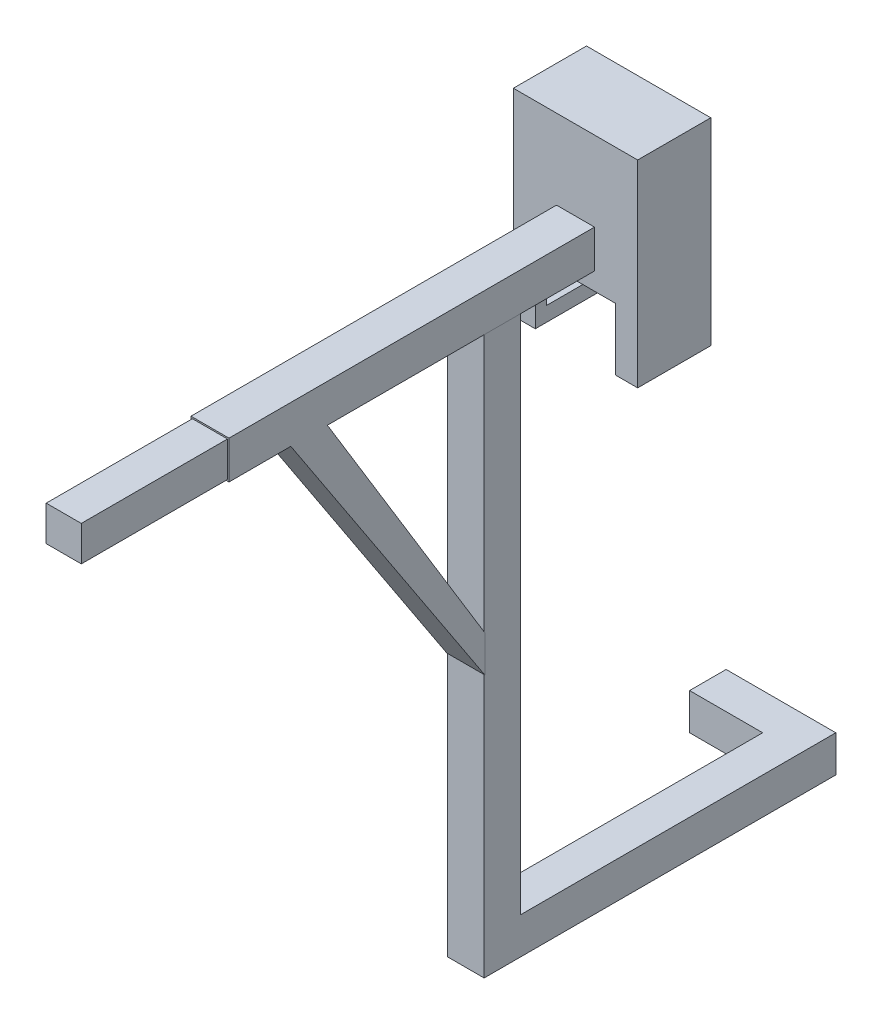
ISO-10303-21;
HEADER;
FILE_DESCRIPTION(('STEP AP214'),'2;1');
FILE_NAME('part.step','',(''),(''),'','','');
FILE_SCHEMA(('AUTOMOTIVE_DESIGN { 1 0 10303 214 1 1 1 1 }'));
ENDSEC;
DATA;
#1=APPLICATION_CONTEXT('core data for automotive mechanical design processes');
#2=APPLICATION_PROTOCOL_DEFINITION('international standard','automotive_design',2000,#1);
#3=PRODUCT_CONTEXT('',#1,'mechanical');
#4=PRODUCT('Part','Part','',(#3));
#5=PRODUCT_RELATED_PRODUCT_CATEGORY('part','',(#4));
#6=PRODUCT_DEFINITION_FORMATION('','',#4);
#7=PRODUCT_DEFINITION_CONTEXT('part definition',#1,'design');
#8=PRODUCT_DEFINITION('design','',#6,#7);
#9=PRODUCT_DEFINITION_SHAPE('','',#8);
#10=(LENGTH_UNIT() NAMED_UNIT(*) SI_UNIT(.MILLI.,.METRE.));
#11=(NAMED_UNIT(*) PLANE_ANGLE_UNIT() SI_UNIT($,.RADIAN.));
#12=(NAMED_UNIT(*) SI_UNIT($,.STERADIAN.) SOLID_ANGLE_UNIT());
#13=UNCERTAINTY_MEASURE_WITH_UNIT(LENGTH_MEASURE(1.E-05),#10,'distance_accuracy_value','');
#14=(GEOMETRIC_REPRESENTATION_CONTEXT(3) GLOBAL_UNCERTAINTY_ASSIGNED_CONTEXT((#13)) GLOBAL_UNIT_ASSIGNED_CONTEXT((#10,
#11,#12)) REPRESENTATION_CONTEXT('',''));
#15=CARTESIAN_POINT('',(0.,0.,0.));
#16=DIRECTION('',(0.,0.,1.));
#17=DIRECTION('',(1.,0.,0.));
#18=AXIS2_PLACEMENT_3D('',#15,#16,#17);
#19=CARTESIAN_POINT('',(-0.100000000000036,-81.3,-40.));
#20=DIRECTION('',(-1.,0.,0.));
#21=DIRECTION('',(0.,-1.,0.));
#22=AXIS2_PLACEMENT_3D('',#19,#20,#21);
#23=PLANE('',#22);
#24=DIRECTION('',(0.,0.,1.));
#25=VECTOR('',#24,1.);
#26=CARTESIAN_POINT('',(-0.100000000000036,-76.3,-83.1));
#27=LINE('',#26,#25);
#28=CARTESIAN_POINT('',(-0.100000000000039,-76.3,-78.1));
#29=VERTEX_POINT('',#28);
#30=CARTESIAN_POINT('',(-0.100000000000034,-76.3,-40.));
#31=VERTEX_POINT('',#30);
#32=EDGE_CURVE('E349',#29,#31,#27,.T.);
#33=ORIENTED_EDGE('',*,*,#32,.F.);
#34=DIRECTION('',(0.,1.,0.));
#35=VECTOR('',#34,1.);
#36=CARTESIAN_POINT('',(-0.100000000000041,-81.3,-78.1));
#37=LINE('',#36,#35);
#38=CARTESIAN_POINT('',(-0.100000000000041,-81.3,-78.1));
#39=VERTEX_POINT('',#38);
#40=EDGE_CURVE('E298',#39,#29,#37,.T.);
#41=ORIENTED_EDGE('',*,*,#40,.F.);
#42=DIRECTION('',(0.,0.,1.));
#43=VECTOR('',#42,1.);
#44=CARTESIAN_POINT('',(-0.100000000000036,-81.3,-40.));
#45=LINE('',#44,#43);
#46=CARTESIAN_POINT('',(-0.100000000000036,-81.3,-35.));
#47=VERTEX_POINT('',#46);
#48=EDGE_CURVE('E353',#39,#47,#45,.T.);
#49=ORIENTED_EDGE('',*,*,#48,.T.);
#50=DIRECTION('',(0.,1.,0.));
#51=VECTOR('',#50,1.);
#52=CARTESIAN_POINT('',(-0.100000000000036,-81.3,-35.));
#53=LINE('',#52,#51);
#54=CARTESIAN_POINT('',(-0.100000000000018,-45.359932103338,-35.));
#55=VERTEX_POINT('',#54);
#56=EDGE_CURVE('E364',#47,#55,#53,.T.);
#57=ORIENTED_EDGE('',*,*,#56,.T.);
#58=CARTESIAN_POINT('',(-0.100000000000017,-40.359932103338,-35.));
#59=VERTEX_POINT('',#58);
#60=EDGE_CURVE('E367',#55,#59,#53,.T.);
#61=ORIENTED_EDGE('',*,*,#60,.T.);
#62=CARTESIAN_POINT('',(-0.100000000000001,-5.,-35.));
#63=VERTEX_POINT('',#62);
#64=EDGE_CURVE('E368',#59,#63,#53,.T.);
#65=ORIENTED_EDGE('',*,*,#64,.T.);
#66=DIRECTION('',(0.,0.,1.));
#67=VECTOR('',#66,1.);
#68=CARTESIAN_POINT('',(-0.100000000000003,-5.,-50.));
#69=LINE('',#68,#67);
#70=CARTESIAN_POINT('',(-0.100000000000037,-5.,-40.));
#71=VERTEX_POINT('',#70);
#72=EDGE_CURVE('E546',#71,#63,#69,.T.);
#73=ORIENTED_EDGE('',*,*,#72,.F.);
#74=DIRECTION('',(0.,1.,0.));
#75=VECTOR('',#74,1.);
#76=CARTESIAN_POINT('',(-0.100000000000036,-81.3,-40.));
#77=LINE('',#76,#75);
#78=EDGE_CURVE('E369',#31,#71,#77,.T.);
#79=ORIENTED_EDGE('',*,*,#78,.F.);
#80=EDGE_LOOP('',(#33,#41,#49,#57,#61,#65,#73,#79));
#81=FACE_BOUND('',#80,.T.);
#82=ADVANCED_FACE('F39',(#81),#23,.T.);
#83=CARTESIAN_POINT('',(5.,-5.,-50.));
#84=DIRECTION('',(0.,1.,0.));
#85=DIRECTION('',(-1.,0.,0.));
#86=AXIS2_PLACEMENT_3D('',#83,#84,#85);
#87=PLANE('',#86);
#88=DIRECTION('',(1.,0.,0.));
#89=VECTOR('',#88,1.);
#90=CARTESIAN_POINT('',(5.,-5.,-35.));
#91=LINE('',#90,#89);
#92=CARTESIAN_POINT('',(4.9,-5.,-35.));
#93=VERTEX_POINT('',#92);
#94=EDGE_CURVE('E47',#63,#93,#91,.T.);
#95=ORIENTED_EDGE('',*,*,#94,.T.);
#96=DIRECTION('',(0.,0.,-1.));
#97=VECTOR('',#96,1.);
#98=CARTESIAN_POINT('',(4.9,-5.,-50.));
#99=LINE('',#98,#97);
#100=CARTESIAN_POINT('',(4.9,-5.,-40.));
#101=VERTEX_POINT('',#100);
#102=EDGE_CURVE('E11',#93,#101,#99,.T.);
#103=ORIENTED_EDGE('',*,*,#102,.T.);
#104=DIRECTION('',(-1.,0.,0.));
#105=VECTOR('',#104,1.);
#106=CARTESIAN_POINT('',(5.,-5.,-40.));
#107=LINE('',#106,#105);
#108=EDGE_CURVE('E543',#101,#71,#107,.T.);
#109=ORIENTED_EDGE('',*,*,#108,.T.);
#110=ORIENTED_EDGE('',*,*,#72,.T.);
#111=EDGE_LOOP('',(#95,#103,#109,#110));
#112=FACE_BOUND('',#111,.T.);
#113=DIRECTION('',(0.,0.,1.));
#114=VECTOR('',#113,1.);
#115=CARTESIAN_POINT('',(5.,-5.,-50.));
#116=LINE('',#115,#114);
#117=CARTESIAN_POINT('',(5.,-5.,-50.));
#118=VERTEX_POINT('',#117);
#119=CARTESIAN_POINT('',(5.,-5.,-13.4557829683408));
#120=VERTEX_POINT('',#119);
#121=EDGE_CURVE('E54',#118,#120,#116,.T.);
#122=ORIENTED_EDGE('',*,*,#121,.T.);
#123=DIRECTION('',(1.,0.,0.));
#124=VECTOR('',#123,1.);
#125=CARTESIAN_POINT('',(-0.2,-5.,-13.4557829683408));
#126=LINE('',#125,#124);
#127=CARTESIAN_POINT('',(-0.2,-5.,-13.4557829683408));
#128=VERTEX_POINT('',#127);
#129=EDGE_CURVE('E327',#128,#120,#126,.T.);
#130=ORIENTED_EDGE('',*,*,#129,.F.);
#131=DIRECTION('',(0.,0.,1.));
#132=VECTOR('',#131,1.);
#133=CARTESIAN_POINT('',(-0.2,-5.,-50.));
#134=LINE('',#133,#132);
#135=CARTESIAN_POINT('',(-0.2,-5.,-50.));
#136=VERTEX_POINT('',#135);
#137=EDGE_CURVE('E488',#136,#128,#134,.T.);
#138=ORIENTED_EDGE('',*,*,#137,.F.);
#139=DIRECTION('',(-1.,0.,0.));
#140=VECTOR('',#139,1.);
#141=CARTESIAN_POINT('',(5.,-5.,-50.));
#142=LINE('',#141,#140);
#143=EDGE_CURVE('E477',#118,#136,#142,.T.);
#144=ORIENTED_EDGE('',*,*,#143,.F.);
#145=EDGE_LOOP('',(#122,#130,#138,#144));
#146=FACE_BOUND('',#145,.T.);
#147=ADVANCED_FACE('F551',(#112,#146),#87,.F.);
#148=CARTESIAN_POINT('',(-0.100000000000036,-81.3,-35.));
#149=DIRECTION('',(0.,0.,1.));
#150=DIRECTION('',(1.,0.,0.));
#151=AXIS2_PLACEMENT_3D('',#148,#149,#150);
#152=PLANE('',#151);
#153=DIRECTION('',(1.,0.,0.));
#154=VECTOR('',#153,1.);
#155=CARTESIAN_POINT('',(-0.2,-40.359932103338,-35.));
#156=LINE('',#155,#154);
#157=CARTESIAN_POINT('',(4.9,-40.359932103338,-35.));
#158=VERTEX_POINT('',#157);
#159=EDGE_CURVE('E332',#59,#158,#156,.T.);
#160=ORIENTED_EDGE('',*,*,#159,.T.);
#161=DIRECTION('',(0.,1.,0.));
#162=VECTOR('',#161,1.);
#163=CARTESIAN_POINT('',(4.89999999999996,-81.3,-35.));
#164=LINE('',#163,#162);
#165=EDGE_CURVE('E363',#158,#93,#164,.T.);
#166=ORIENTED_EDGE('',*,*,#165,.T.);
#167=ORIENTED_EDGE('',*,*,#94,.F.);
#168=ORIENTED_EDGE('',*,*,#64,.F.);
#169=EDGE_LOOP('',(#160,#166,#167,#168));
#170=FACE_BOUND('',#169,.T.);
#171=ADVANCED_FACE('F557',(#170),#152,.T.);
#172=CARTESIAN_POINT('',(-0.100000000000036,-81.3,-40.));
#173=DIRECTION('',(0.,0.,-1.));
#174=DIRECTION('',(-1.,0.,0.));
#175=AXIS2_PLACEMENT_3D('',#172,#173,#174);
#176=PLANE('',#175);
#177=DIRECTION('',(0.,1.,0.));
#178=VECTOR('',#177,1.);
#179=CARTESIAN_POINT('',(4.89999999999996,-81.3,-40.));
#180=LINE('',#179,#178);
#181=CARTESIAN_POINT('',(4.89999999999997,-76.3,-40.));
#182=VERTEX_POINT('',#181);
#183=EDGE_CURVE('E358',#182,#101,#180,.T.);
#184=ORIENTED_EDGE('',*,*,#183,.F.);
#185=DIRECTION('',(1.,0.,0.));
#186=VECTOR('',#185,1.);
#187=CARTESIAN_POINT('',(4.89999999999996,-76.3,-40.));
#188=LINE('',#187,#186);
#189=EDGE_CURVE('E341',#31,#182,#188,.T.);
#190=ORIENTED_EDGE('',*,*,#189,.F.);
#191=ORIENTED_EDGE('',*,*,#78,.T.);
#192=ORIENTED_EDGE('',*,*,#108,.F.);
#193=EDGE_LOOP('',(#184,#190,#191,#192));
#194=FACE_BOUND('',#193,.T.);
#195=ADVANCED_FACE('F568',(#194),#176,.T.);
#196=CARTESIAN_POINT('',(0.,0.,20.));
#197=DIRECTION('',(1.,0.,0.));
#198=DIRECTION('',(0.,0.,-1.));
#199=AXIS2_PLACEMENT_3D('',#196,#197,#198);
#200=PLANE('',#199);
#201=DIRECTION('',(0.,-1.,0.));
#202=VECTOR('',#201,1.);
#203=CARTESIAN_POINT('',(0.,0.,0.));
#204=LINE('',#203,#202);
#205=CARTESIAN_POINT('',(0.,0.,0.));
#206=VERTEX_POINT('',#205);
#207=CARTESIAN_POINT('',(0.,-4.8,0.));
#208=VERTEX_POINT('',#207);
#209=EDGE_CURVE('E499',#206,#208,#204,.T.);
#210=ORIENTED_EDGE('',*,*,#209,.T.);
#211=DIRECTION('',(0.,0.,-1.));
#212=VECTOR('',#211,1.);
#213=CARTESIAN_POINT('',(0.,-4.8,20.));
#214=LINE('',#213,#212);
#215=CARTESIAN_POINT('',(0.,-4.8,20.));
#216=VERTEX_POINT('',#215);
#217=EDGE_CURVE('E529',#216,#208,#214,.T.);
#218=ORIENTED_EDGE('',*,*,#217,.F.);
#219=DIRECTION('',(0.,-1.,0.));
#220=VECTOR('',#219,1.);
#221=CARTESIAN_POINT('',(0.,0.,20.));
#222=LINE('',#221,#220);
#223=CARTESIAN_POINT('',(0.,0.,20.));
#224=VERTEX_POINT('',#223);
#225=EDGE_CURVE('E500',#224,#216,#222,.T.);
#226=ORIENTED_EDGE('',*,*,#225,.F.);
#227=DIRECTION('',(0.,0.,-1.));
#228=VECTOR('',#227,1.);
#229=CARTESIAN_POINT('',(0.,0.,20.));
#230=LINE('',#229,#228);
#231=EDGE_CURVE('E510',#224,#206,#230,.T.);
#232=ORIENTED_EDGE('',*,*,#231,.T.);
#233=EDGE_LOOP('',(#210,#218,#226,#232));
#234=FACE_BOUND('',#233,.T.);
#235=ADVANCED_FACE('F41',(#234),#200,.F.);
#236=CARTESIAN_POINT('',(0.,-4.8,20.));
#237=DIRECTION('',(0.,1.,0.));
#238=DIRECTION('',(0.,0.,1.));
#239=AXIS2_PLACEMENT_3D('',#236,#237,#238);
#240=PLANE('',#239);
#241=DIRECTION('',(1.,0.,0.));
#242=VECTOR('',#241,1.);
#243=CARTESIAN_POINT('',(0.,-4.8,0.));
#244=LINE('',#243,#242);
#245=CARTESIAN_POINT('',(4.79999999999998,-4.8,0.));
#246=VERTEX_POINT('',#245);
#247=EDGE_CURVE('E513',#208,#246,#244,.T.);
#248=ORIENTED_EDGE('',*,*,#247,.T.);
#249=DIRECTION('',(0.,0.,-1.));
#250=VECTOR('',#249,1.);
#251=CARTESIAN_POINT('',(4.79999999999998,-4.8,20.));
#252=LINE('',#251,#250);
#253=CARTESIAN_POINT('',(4.79999999999998,-4.8,20.));
#254=VERTEX_POINT('',#253);
#255=EDGE_CURVE('E526',#254,#246,#252,.T.);
#256=ORIENTED_EDGE('',*,*,#255,.F.);
#257=DIRECTION('',(1.,0.,0.));
#258=VECTOR('',#257,1.);
#259=CARTESIAN_POINT('',(0.,-4.8,20.));
#260=LINE('',#259,#258);
#261=EDGE_CURVE('E503',#216,#254,#260,.T.);
#262=ORIENTED_EDGE('',*,*,#261,.F.);
#263=ORIENTED_EDGE('',*,*,#217,.T.);
#264=EDGE_LOOP('',(#248,#256,#262,#263));
#265=FACE_BOUND('',#264,.T.);
#266=ADVANCED_FACE('F1065',(#265),#240,.F.);
#267=CARTESIAN_POINT('',(4.79999999999998,0.,20.));
#268=DIRECTION('',(-1.,0.,0.));
#269=DIRECTION('',(0.,0.,1.));
#270=AXIS2_PLACEMENT_3D('',#267,#268,#269);
#271=PLANE('',#270);
#272=DIRECTION('',(0.,1.,0.));
#273=VECTOR('',#272,1.);
#274=CARTESIAN_POINT('',(4.79999999999998,0.,0.));
#275=LINE('',#274,#273);
#276=CARTESIAN_POINT('',(4.79999999999998,0.,0.));
#277=VERTEX_POINT('',#276);
#278=EDGE_CURVE('E516',#246,#277,#275,.T.);
#279=ORIENTED_EDGE('',*,*,#278,.T.);
#280=DIRECTION('',(0.,0.,-1.));
#281=VECTOR('',#280,1.);
#282=CARTESIAN_POINT('',(4.79999999999998,0.,20.));
#283=LINE('',#282,#281);
#284=CARTESIAN_POINT('',(4.79999999999998,0.,20.));
#285=VERTEX_POINT('',#284);
#286=EDGE_CURVE('E523',#285,#277,#283,.T.);
#287=ORIENTED_EDGE('',*,*,#286,.F.);
#288=DIRECTION('',(0.,1.,0.));
#289=VECTOR('',#288,1.);
#290=CARTESIAN_POINT('',(4.79999999999998,0.,20.));
#291=LINE('',#290,#289);
#292=EDGE_CURVE('E506',#254,#285,#291,.T.);
#293=ORIENTED_EDGE('',*,*,#292,.F.);
#294=ORIENTED_EDGE('',*,*,#255,.T.);
#295=EDGE_LOOP('',(#279,#287,#293,#294));
#296=FACE_BOUND('',#295,.T.);
#297=ADVANCED_FACE('F1055',(#296),#271,.F.);
#298=CARTESIAN_POINT('',(0.,0.,20.));
#299=DIRECTION('',(0.,-1.,0.));
#300=DIRECTION('',(0.,0.,-1.));
#301=AXIS2_PLACEMENT_3D('',#298,#299,#300);
#302=PLANE('',#301);
#303=DIRECTION('',(-1.,0.,0.));
#304=VECTOR('',#303,1.);
#305=CARTESIAN_POINT('',(0.,0.,0.));
#306=LINE('',#305,#304);
#307=EDGE_CURVE('E504',#277,#206,#306,.T.);
#308=ORIENTED_EDGE('',*,*,#307,.T.);
#309=ORIENTED_EDGE('',*,*,#231,.F.);
#310=DIRECTION('',(-1.,0.,0.));
#311=VECTOR('',#310,1.);
#312=CARTESIAN_POINT('',(0.,0.,20.));
#313=LINE('',#312,#311);
#314=EDGE_CURVE('E508',#285,#224,#313,.T.);
#315=ORIENTED_EDGE('',*,*,#314,.F.);
#316=ORIENTED_EDGE('',*,*,#286,.T.);
#317=EDGE_LOOP('',(#308,#309,#315,#316));
#318=FACE_BOUND('',#317,.T.);
#319=ADVANCED_FACE('F1045',(#318),#302,.F.);
#320=CARTESIAN_POINT('',(0.,0.,20.));
#321=DIRECTION('',(0.,0.,1.));
#322=DIRECTION('',(1.,0.,0.));
#323=AXIS2_PLACEMENT_3D('',#320,#321,#322);
#324=PLANE('',#323);
#325=ORIENTED_EDGE('',*,*,#225,.T.);
#326=ORIENTED_EDGE('',*,*,#261,.T.);
#327=ORIENTED_EDGE('',*,*,#292,.T.);
#328=ORIENTED_EDGE('',*,*,#314,.T.);
#329=EDGE_LOOP('',(#325,#326,#327,#328));
#330=FACE_BOUND('',#329,.T.);
#331=ADVANCED_FACE('F801',(#330),#324,.T.);
#332=CARTESIAN_POINT('',(-0.199999999999999,0.199999999999999,-50.));
#333=DIRECTION('',(1.,0.,0.));
#334=DIRECTION('',(0.,1.,0.));
#335=AXIS2_PLACEMENT_3D('',#332,#333,#334);
#336=PLANE('',#335);
#337=DIRECTION('',(0.,1.,0.));
#338=VECTOR('',#337,1.);
#339=CARTESIAN_POINT('',(-0.199999999999999,0.199999999999999,0.));
#340=LINE('',#339,#338);
#341=CARTESIAN_POINT('',(-0.2,-5.,0.));
#342=VERTEX_POINT('',#341);
#343=CARTESIAN_POINT('',(-0.199999999999999,0.199999999999999,0.));
#344=VERTEX_POINT('',#343);
#345=EDGE_CURVE('E466',#342,#344,#340,.T.);
#346=ORIENTED_EDGE('',*,*,#345,.T.);
#347=DIRECTION('',(0.,0.,1.));
#348=VECTOR('',#347,1.);
#349=CARTESIAN_POINT('',(-0.199999999999999,0.199999999999999,-50.));
#350=LINE('',#349,#348);
#351=CARTESIAN_POINT('',(-0.199999999999999,0.199999999999999,-50.));
#352=VERTEX_POINT('',#351);
#353=EDGE_CURVE('E496',#352,#344,#350,.T.);
#354=ORIENTED_EDGE('',*,*,#353,.F.);
#355=DIRECTION('',(0.,1.,0.));
#356=VECTOR('',#355,1.);
#357=CARTESIAN_POINT('',(-0.199999999999999,0.199999999999999,-50.));
#358=LINE('',#357,#356);
#359=EDGE_CURVE('E467',#136,#352,#358,.T.);
#360=ORIENTED_EDGE('',*,*,#359,.F.);
#361=ORIENTED_EDGE('',*,*,#137,.T.);
#362=DIRECTION('',(0.,0.853975582543148,0.520313083076038));
#363=VECTOR('',#362,1.);
#364=CARTESIAN_POINT('',(-0.2,-5.,-13.4557829683408));
#365=LINE('',#364,#363);
#366=CARTESIAN_POINT('',(-0.2,-40.359932103338,-35.));
#367=VERTEX_POINT('',#366);
#368=EDGE_CURVE('E316',#367,#128,#365,.T.);
#369=ORIENTED_EDGE('',*,*,#368,.F.);
#370=DIRECTION('',(0.,1.,0.));
#371=VECTOR('',#370,1.);
#372=CARTESIAN_POINT('',(-0.2,-40.359932103338,-35.));
#373=LINE('',#372,#371);
#374=CARTESIAN_POINT('',(-0.2,-45.359932103338,-35.));
#375=VERTEX_POINT('',#374);
#376=EDGE_CURVE('E312',#375,#367,#373,.T.);
#377=ORIENTED_EDGE('',*,*,#376,.F.);
#378=DIRECTION('',(0.,-0.835496630151648,-0.549495569595644));
#379=VECTOR('',#378,1.);
#380=CARTESIAN_POINT('',(-0.2,-5.,-8.45578296834082));
#381=LINE('',#380,#379);
#382=CARTESIAN_POINT('',(-0.2,-5.,-8.45578296834083));
#383=VERTEX_POINT('',#382);
#384=EDGE_CURVE('E309',#383,#375,#381,.T.);
#385=ORIENTED_EDGE('',*,*,#384,.F.);
#386=EDGE_CURVE('E62',#383,#342,#134,.T.);
#387=ORIENTED_EDGE('',*,*,#386,.T.);
#388=EDGE_LOOP('',(#346,#354,#360,#361,#369,#377,#385,#387));
#389=FACE_BOUND('',#388,.T.);
#390=ADVANCED_FACE('F596',(#389),#336,.F.);
#391=CARTESIAN_POINT('',(5.,0.199999999999997,-50.));
#392=DIRECTION('',(0.,-1.,0.));
#393=DIRECTION('',(1.,0.,0.));
#394=AXIS2_PLACEMENT_3D('',#391,#392,#393);
#395=PLANE('',#394);
#396=DIRECTION('',(1.,0.,0.));
#397=VECTOR('',#396,1.);
#398=CARTESIAN_POINT('',(5.,0.199999999999997,0.));
#399=LINE('',#398,#397);
#400=CARTESIAN_POINT('',(5.,0.199999999999997,0.));
#401=VERTEX_POINT('',#400);
#402=EDGE_CURVE('E482',#344,#401,#399,.T.);
#403=ORIENTED_EDGE('',*,*,#402,.T.);
#404=DIRECTION('',(0.,0.,1.));
#405=VECTOR('',#404,1.);
#406=CARTESIAN_POINT('',(5.,0.199999999999997,-50.));
#407=LINE('',#406,#405);
#408=CARTESIAN_POINT('',(5.,0.199999999999997,-50.));
#409=VERTEX_POINT('',#408);
#410=EDGE_CURVE('E493',#409,#401,#407,.T.);
#411=ORIENTED_EDGE('',*,*,#410,.F.);
#412=DIRECTION('',(1.,0.,0.));
#413=VECTOR('',#412,1.);
#414=CARTESIAN_POINT('',(5.,0.199999999999997,-50.));
#415=LINE('',#414,#413);
#416=EDGE_CURVE('E470',#352,#409,#415,.T.);
#417=ORIENTED_EDGE('',*,*,#416,.F.);
#418=ORIENTED_EDGE('',*,*,#353,.T.);
#419=EDGE_LOOP('',(#403,#411,#417,#418));
#420=FACE_BOUND('',#419,.T.);
#421=ADVANCED_FACE('F606',(#420),#395,.F.);
#422=CARTESIAN_POINT('',(5.,0.199999999999997,-50.));
#423=DIRECTION('',(-1.,0.,0.));
#424=DIRECTION('',(0.,0.,1.));
#425=AXIS2_PLACEMENT_3D('',#422,#423,#424);
#426=PLANE('',#425);
#427=DIRECTION('',(0.,-1.,0.));
#428=VECTOR('',#427,1.);
#429=CARTESIAN_POINT('',(5.,0.199999999999997,0.));
#430=LINE('',#429,#428);
#431=CARTESIAN_POINT('',(5.,-5.,0.));
#432=VERTEX_POINT('',#431);
#433=EDGE_CURVE('E484',#401,#432,#430,.T.);
#434=ORIENTED_EDGE('',*,*,#433,.T.);
#435=CARTESIAN_POINT('',(5.,-5.,-8.45578296834082));
#436=VERTEX_POINT('',#435);
#437=EDGE_CURVE('E491',#436,#432,#116,.T.);
#438=ORIENTED_EDGE('',*,*,#437,.F.);
#439=DIRECTION('',(0.,-0.835496630151648,-0.549495569595644));
#440=VECTOR('',#439,1.);
#441=CARTESIAN_POINT('',(5.,-5.,-8.45578296834082));
#442=LINE('',#441,#440);
#443=CARTESIAN_POINT('',(5.,-45.359932103338,-35.));
#444=VERTEX_POINT('',#443);
#445=EDGE_CURVE('E308',#436,#444,#442,.T.);
#446=ORIENTED_EDGE('',*,*,#445,.T.);
#447=DIRECTION('',(0.,1.,0.));
#448=VECTOR('',#447,1.);
#449=CARTESIAN_POINT('',(5.,-40.359932103338,-35.));
#450=LINE('',#449,#448);
#451=CARTESIAN_POINT('',(5.,-40.359932103338,-35.));
#452=VERTEX_POINT('',#451);
#453=EDGE_CURVE('E322',#444,#452,#450,.T.);
#454=ORIENTED_EDGE('',*,*,#453,.T.);
#455=DIRECTION('',(0.,0.853975582543148,0.520313083076038));
#456=VECTOR('',#455,1.);
#457=CARTESIAN_POINT('',(5.,-5.,-13.4557829683408));
#458=LINE('',#457,#456);
#459=EDGE_CURVE('E313',#452,#120,#458,.T.);
#460=ORIENTED_EDGE('',*,*,#459,.T.);
#461=ORIENTED_EDGE('',*,*,#121,.F.);
#462=DIRECTION('',(0.,-1.,0.));
#463=VECTOR('',#462,1.);
#464=CARTESIAN_POINT('',(5.,0.199999999999997,-50.));
#465=LINE('',#464,#463);
#466=EDGE_CURVE('E474',#409,#118,#465,.T.);
#467=ORIENTED_EDGE('',*,*,#466,.F.);
#468=ORIENTED_EDGE('',*,*,#410,.T.);
#469=EDGE_LOOP('',(#434,#438,#446,#454,#460,#461,#467,#468));
#470=FACE_BOUND('',#469,.T.);
#471=ADVANCED_FACE('F591',(#470),#426,.F.);
#472=ORIENTED_EDGE('',*,*,#386,.F.);
#473=DIRECTION('',(1.,0.,0.));
#474=VECTOR('',#473,1.);
#475=CARTESIAN_POINT('',(-0.2,-5.,-8.45578296834082));
#476=LINE('',#475,#474);
#477=EDGE_CURVE('E319',#383,#436,#476,.T.);
#478=ORIENTED_EDGE('',*,*,#477,.T.);
#479=ORIENTED_EDGE('',*,*,#437,.T.);
#480=DIRECTION('',(-1.,0.,0.));
#481=VECTOR('',#480,1.);
#482=CARTESIAN_POINT('',(5.,-5.,0.));
#483=LINE('',#482,#481);
#484=EDGE_CURVE('E471',#432,#342,#483,.T.);
#485=ORIENTED_EDGE('',*,*,#484,.T.);
#486=EDGE_LOOP('',(#472,#478,#479,#485));
#487=FACE_BOUND('',#486,.T.);
#488=ADVANCED_FACE('F594',(#487),#87,.F.);
#489=CARTESIAN_POINT('',(0.,0.,0.));
#490=DIRECTION('',(0.,0.,-1.));
#491=DIRECTION('',(-1.,0.,0.));
#492=AXIS2_PLACEMENT_3D('',#489,#490,#491);
#493=PLANE('',#492);
#494=ORIENTED_EDGE('',*,*,#209,.F.);
#495=ORIENTED_EDGE('',*,*,#307,.F.);
#496=ORIENTED_EDGE('',*,*,#278,.F.);
#497=ORIENTED_EDGE('',*,*,#247,.F.);
#498=EDGE_LOOP('',(#494,#495,#496,#497));
#499=FACE_BOUND('',#498,.T.);
#500=ORIENTED_EDGE('',*,*,#345,.F.);
#501=ORIENTED_EDGE('',*,*,#484,.F.);
#502=ORIENTED_EDGE('',*,*,#433,.F.);
#503=ORIENTED_EDGE('',*,*,#402,.F.);
#504=EDGE_LOOP('',(#500,#501,#502,#503));
#505=FACE_BOUND('',#504,.T.);
#506=ADVANCED_FACE('F609',(#499,#505),#493,.F.);
#507=CARTESIAN_POINT('',(0.,0.,-50.));
#508=DIRECTION('',(0.,0.,-1.));
#509=DIRECTION('',(-1.,0.,0.));
#510=AXIS2_PLACEMENT_3D('',#507,#508,#509);
#511=PLANE('',#510);
#512=DIRECTION('',(-1.,0.,0.));
#513=VECTOR('',#512,1.);
#514=CARTESIAN_POINT('',(10.9,-15.9,-50.));
#515=LINE('',#514,#513);
#516=CARTESIAN_POINT('',(-3.1,-15.9,-50.));
#517=VERTEX_POINT('',#516);
#518=CARTESIAN_POINT('',(-6.1,-15.9,-50.));
#519=VERTEX_POINT('',#518);
#520=EDGE_CURVE('E452',#517,#519,#515,.T.);
#521=ORIENTED_EDGE('',*,*,#520,.F.);
#522=DIRECTION('',(0.,-1.,0.));
#523=VECTOR('',#522,1.);
#524=CARTESIAN_POINT('',(-3.1,-7.4,-50.));
#525=LINE('',#524,#523);
#526=CARTESIAN_POINT('',(-3.1,-7.4,-50.));
#527=VERTEX_POINT('',#526);
#528=EDGE_CURVE('E386',#527,#517,#525,.T.);
#529=ORIENTED_EDGE('',*,*,#528,.F.);
#530=DIRECTION('',(-1.,0.,0.));
#531=VECTOR('',#530,1.);
#532=CARTESIAN_POINT('',(-3.1,-7.4,-50.));
#533=LINE('',#532,#531);
#534=CARTESIAN_POINT('',(7.9,-7.4,-50.));
#535=VERTEX_POINT('',#534);
#536=EDGE_CURVE('E377',#535,#527,#533,.T.);
#537=ORIENTED_EDGE('',*,*,#536,.F.);
#538=DIRECTION('',(0.,-1.,0.));
#539=VECTOR('',#538,1.);
#540=CARTESIAN_POINT('',(7.9,-7.4,-50.));
#541=LINE('',#540,#539);
#542=CARTESIAN_POINT('',(7.9,-15.9,-50.));
#543=VERTEX_POINT('',#542);
#544=EDGE_CURVE('E389',#535,#543,#541,.T.);
#545=ORIENTED_EDGE('',*,*,#544,.T.);
#546=CARTESIAN_POINT('',(10.9,-15.9,-50.));
#547=VERTEX_POINT('',#546);
#548=EDGE_CURVE('E439',#547,#543,#515,.T.);
#549=ORIENTED_EDGE('',*,*,#548,.F.);
#550=DIRECTION('',(0.,-1.,0.));
#551=VECTOR('',#550,1.);
#552=CARTESIAN_POINT('',(10.9,11.1,-50.));
#553=LINE('',#552,#551);
#554=CARTESIAN_POINT('',(10.9,11.1,-50.));
#555=VERTEX_POINT('',#554);
#556=EDGE_CURVE('E450',#555,#547,#553,.T.);
#557=ORIENTED_EDGE('',*,*,#556,.F.);
#558=DIRECTION('',(1.,0.,0.));
#559=VECTOR('',#558,1.);
#560=CARTESIAN_POINT('',(10.9,11.1,-50.));
#561=LINE('',#560,#559);
#562=CARTESIAN_POINT('',(-6.1,11.1,-50.));
#563=VERTEX_POINT('',#562);
#564=EDGE_CURVE('E448',#563,#555,#561,.T.);
#565=ORIENTED_EDGE('',*,*,#564,.F.);
#566=DIRECTION('',(0.,1.,0.));
#567=VECTOR('',#566,1.);
#568=CARTESIAN_POINT('',(-6.1,11.1,-50.));
#569=LINE('',#568,#567);
#570=EDGE_CURVE('E428',#519,#563,#569,.T.);
#571=ORIENTED_EDGE('',*,*,#570,.F.);
#572=EDGE_LOOP('',(#521,#529,#537,#545,#549,#557,#565,#571));
#573=FACE_BOUND('',#572,.T.);
#574=ORIENTED_EDGE('',*,*,#143,.T.);
#575=ORIENTED_EDGE('',*,*,#359,.T.);
#576=ORIENTED_EDGE('',*,*,#416,.T.);
#577=ORIENTED_EDGE('',*,*,#466,.T.);
#578=EDGE_LOOP('',(#574,#575,#576,#577));
#579=FACE_BOUND('',#578,.T.);
#580=ADVANCED_FACE('F603',(#573,#579),#511,.F.);
#581=CARTESIAN_POINT('',(-6.1,11.1,-60.));
#582=DIRECTION('',(1.,0.,0.));
#583=DIRECTION('',(0.,1.,0.));
#584=AXIS2_PLACEMENT_3D('',#581,#582,#583);
#585=PLANE('',#584);
#586=ORIENTED_EDGE('',*,*,#570,.T.);
#587=DIRECTION('',(0.,0.,1.));
#588=VECTOR('',#587,1.);
#589=CARTESIAN_POINT('',(-6.1,11.1,-60.));
#590=LINE('',#589,#588);
#591=CARTESIAN_POINT('',(-6.1,11.1,-60.));
#592=VERTEX_POINT('',#591);
#593=EDGE_CURVE('E463',#592,#563,#590,.T.);
#594=ORIENTED_EDGE('',*,*,#593,.F.);
#595=DIRECTION('',(0.,1.,0.));
#596=VECTOR('',#595,1.);
#597=CARTESIAN_POINT('',(-6.1,11.1,-60.));
#598=LINE('',#597,#596);
#599=CARTESIAN_POINT('',(-6.1,-15.9,-60.));
#600=VERTEX_POINT('',#599);
#601=EDGE_CURVE('E435',#600,#592,#598,.T.);
#602=ORIENTED_EDGE('',*,*,#601,.F.);
#603=DIRECTION('',(0.,0.,1.));
#604=VECTOR('',#603,1.);
#605=CARTESIAN_POINT('',(-6.1,-15.9,-60.));
#606=LINE('',#605,#604);
#607=EDGE_CURVE('E445',#600,#519,#606,.T.);
#608=ORIENTED_EDGE('',*,*,#607,.T.);
#609=EDGE_LOOP('',(#586,#594,#602,#608));
#610=FACE_BOUND('',#609,.T.);
#611=ADVANCED_FACE('F617',(#610),#585,.F.);
#612=CARTESIAN_POINT('',(10.9,11.1,-60.));
#613=DIRECTION('',(0.,-1.,0.));
#614=DIRECTION('',(0.,0.,-1.));
#615=AXIS2_PLACEMENT_3D('',#612,#613,#614);
#616=PLANE('',#615);
#617=ORIENTED_EDGE('',*,*,#564,.T.);
#618=DIRECTION('',(0.,0.,1.));
#619=VECTOR('',#618,1.);
#620=CARTESIAN_POINT('',(10.9,11.1,-60.));
#621=LINE('',#620,#619);
#622=CARTESIAN_POINT('',(10.9,11.1,-60.));
#623=VERTEX_POINT('',#622);
#624=EDGE_CURVE('E460',#623,#555,#621,.T.);
#625=ORIENTED_EDGE('',*,*,#624,.F.);
#626=DIRECTION('',(1.,0.,0.));
#627=VECTOR('',#626,1.);
#628=CARTESIAN_POINT('',(10.9,11.1,-60.));
#629=LINE('',#628,#627);
#630=EDGE_CURVE('E438',#592,#623,#629,.T.);
#631=ORIENTED_EDGE('',*,*,#630,.F.);
#632=ORIENTED_EDGE('',*,*,#593,.T.);
#633=EDGE_LOOP('',(#617,#625,#631,#632));
#634=FACE_BOUND('',#633,.T.);
#635=ADVANCED_FACE('F684',(#634),#616,.F.);
#636=CARTESIAN_POINT('',(10.9,11.1,-60.));
#637=DIRECTION('',(-1.,0.,0.));
#638=DIRECTION('',(0.,-1.,0.));
#639=AXIS2_PLACEMENT_3D('',#636,#637,#638);
#640=PLANE('',#639);
#641=ORIENTED_EDGE('',*,*,#556,.T.);
#642=DIRECTION('',(0.,0.,1.));
#643=VECTOR('',#642,1.);
#644=CARTESIAN_POINT('',(10.9,-15.9,-60.));
#645=LINE('',#644,#643);
#646=CARTESIAN_POINT('',(10.9,-15.9,-60.));
#647=VERTEX_POINT('',#646);
#648=EDGE_CURVE('E457',#647,#547,#645,.T.);
#649=ORIENTED_EDGE('',*,*,#648,.F.);
#650=DIRECTION('',(0.,-1.,0.));
#651=VECTOR('',#650,1.);
#652=CARTESIAN_POINT('',(10.9,11.1,-60.));
#653=LINE('',#652,#651);
#654=EDGE_CURVE('E441',#623,#647,#653,.T.);
#655=ORIENTED_EDGE('',*,*,#654,.F.);
#656=ORIENTED_EDGE('',*,*,#624,.T.);
#657=EDGE_LOOP('',(#641,#649,#655,#656));
#658=FACE_BOUND('',#657,.T.);
#659=ADVANCED_FACE('F680',(#658),#640,.F.);
#660=CARTESIAN_POINT('',(10.9,-15.9,-60.));
#661=DIRECTION('',(0.,1.,0.));
#662=DIRECTION('',(0.,0.,1.));
#663=AXIS2_PLACEMENT_3D('',#660,#661,#662);
#664=PLANE('',#663);
#665=DIRECTION('',(1.,0.,0.));
#666=VECTOR('',#665,1.);
#667=CARTESIAN_POINT('',(-3.1,-15.9,-58.5));
#668=LINE('',#667,#666);
#669=CARTESIAN_POINT('',(-3.1,-15.9,-58.5));
#670=VERTEX_POINT('',#669);
#671=CARTESIAN_POINT('',(7.9,-15.9,-58.5));
#672=VERTEX_POINT('',#671);
#673=EDGE_CURVE('E382',#670,#672,#668,.T.);
#674=ORIENTED_EDGE('',*,*,#673,.F.);
#675=DIRECTION('',(0.,0.,-1.));
#676=VECTOR('',#675,1.);
#677=CARTESIAN_POINT('',(-3.1,-15.9,-50.));
#678=LINE('',#677,#676);
#679=EDGE_CURVE('E362',#517,#670,#678,.T.);
#680=ORIENTED_EDGE('',*,*,#679,.F.);
#681=ORIENTED_EDGE('',*,*,#520,.T.);
#682=ORIENTED_EDGE('',*,*,#607,.F.);
#683=DIRECTION('',(-1.,0.,0.));
#684=VECTOR('',#683,1.);
#685=CARTESIAN_POINT('',(10.9,-15.9,-60.));
#686=LINE('',#685,#684);
#687=EDGE_CURVE('E443',#647,#600,#686,.T.);
#688=ORIENTED_EDGE('',*,*,#687,.F.);
#689=ORIENTED_EDGE('',*,*,#648,.T.);
#690=ORIENTED_EDGE('',*,*,#548,.T.);
#691=DIRECTION('',(0.,0.,1.));
#692=VECTOR('',#691,1.);
#693=CARTESIAN_POINT('',(7.9,-15.9,-50.));
#694=LINE('',#693,#692);
#695=EDGE_CURVE('E375',#672,#543,#694,.T.);
#696=ORIENTED_EDGE('',*,*,#695,.F.);
#697=EDGE_LOOP('',(#674,#680,#681,#682,#688,#689,#690,#696));
#698=FACE_BOUND('',#697,.T.);
#699=ADVANCED_FACE('F675',(#698),#664,.F.);
#700=CARTESIAN_POINT('',(0.,0.,-60.));
#701=DIRECTION('',(0.,0.,-1.));
#702=DIRECTION('',(-1.,0.,0.));
#703=AXIS2_PLACEMENT_3D('',#700,#701,#702);
#704=PLANE('',#703);
#705=DIRECTION('',(0.,-1.,0.));
#706=VECTOR('',#705,1.);
#707=CARTESIAN_POINT('',(8.9,9.09999999999999,-60.));
#708=LINE('',#707,#706);
#709=CARTESIAN_POINT('',(8.9,9.09999999999999,-60.));
#710=VERTEX_POINT('',#709);
#711=CARTESIAN_POINT('',(8.9,-13.9,-60.));
#712=VERTEX_POINT('',#711);
#713=EDGE_CURVE('E401',#710,#712,#708,.T.);
#714=ORIENTED_EDGE('',*,*,#713,.F.);
#715=DIRECTION('',(1.,0.,0.));
#716=VECTOR('',#715,1.);
#717=CARTESIAN_POINT('',(-4.1,9.1,-60.));
#718=LINE('',#717,#716);
#719=CARTESIAN_POINT('',(-4.1,9.1,-60.));
#720=VERTEX_POINT('',#719);
#721=EDGE_CURVE('E406',#720,#710,#718,.T.);
#722=ORIENTED_EDGE('',*,*,#721,.F.);
#723=DIRECTION('',(0.,1.,0.));
#724=VECTOR('',#723,1.);
#725=CARTESIAN_POINT('',(-4.1,9.1,-60.));
#726=LINE('',#725,#724);
#727=CARTESIAN_POINT('',(-4.1,-13.9,-60.));
#728=VERTEX_POINT('',#727);
#729=EDGE_CURVE('E421',#728,#720,#726,.T.);
#730=ORIENTED_EDGE('',*,*,#729,.F.);
#731=DIRECTION('',(-1.,0.,0.));
#732=VECTOR('',#731,1.);
#733=CARTESIAN_POINT('',(-4.1,-13.9,-60.));
#734=LINE('',#733,#732);
#735=EDGE_CURVE('E418',#712,#728,#734,.T.);
#736=ORIENTED_EDGE('',*,*,#735,.F.);
#737=EDGE_LOOP('',(#714,#722,#730,#736));
#738=FACE_BOUND('',#737,.T.);
#739=ORIENTED_EDGE('',*,*,#601,.T.);
#740=ORIENTED_EDGE('',*,*,#630,.T.);
#741=ORIENTED_EDGE('',*,*,#654,.T.);
#742=ORIENTED_EDGE('',*,*,#687,.T.);
#743=EDGE_LOOP('',(#739,#740,#741,#742));
#744=FACE_BOUND('',#743,.T.);
#745=ADVANCED_FACE('F672',(#738,#744),#704,.T.);
#746=CARTESIAN_POINT('',(8.9,9.09999999999999,-51.5));
#747=DIRECTION('',(1.,0.,0.));
#748=DIRECTION('',(0.,1.,0.));
#749=AXIS2_PLACEMENT_3D('',#746,#747,#748);
#750=PLANE('',#749);
#751=ORIENTED_EDGE('',*,*,#713,.T.);
#752=DIRECTION('',(0.,0.,-1.));
#753=VECTOR('',#752,1.);
#754=CARTESIAN_POINT('',(8.9,-13.9,-51.5));
#755=LINE('',#754,#753);
#756=CARTESIAN_POINT('',(8.9,-13.9,-51.5));
#757=VERTEX_POINT('',#756);
#758=EDGE_CURVE('E416',#757,#712,#755,.T.);
#759=ORIENTED_EDGE('',*,*,#758,.F.);
#760=DIRECTION('',(0.,-1.,0.));
#761=VECTOR('',#760,1.);
#762=CARTESIAN_POINT('',(8.9,9.09999999999999,-51.5));
#763=LINE('',#762,#761);
#764=CARTESIAN_POINT('',(8.9,9.09999999999999,-51.5));
#765=VERTEX_POINT('',#764);
#766=EDGE_CURVE('E402',#765,#757,#763,.T.);
#767=ORIENTED_EDGE('',*,*,#766,.F.);
#768=DIRECTION('',(0.,0.,-1.));
#769=VECTOR('',#768,1.);
#770=CARTESIAN_POINT('',(8.9,9.09999999999999,-51.5));
#771=LINE('',#770,#769);
#772=EDGE_CURVE('E426',#765,#710,#771,.T.);
#773=ORIENTED_EDGE('',*,*,#772,.T.);
#774=EDGE_LOOP('',(#751,#759,#767,#773));
#775=FACE_BOUND('',#774,.T.);
#776=ADVANCED_FACE('F662',(#775),#750,.F.);
#777=CARTESIAN_POINT('',(-4.1,9.1,-51.5));
#778=DIRECTION('',(0.,1.,0.));
#779=DIRECTION('',(-1.,0.,0.));
#780=AXIS2_PLACEMENT_3D('',#777,#778,#779);
#781=PLANE('',#780);
#782=ORIENTED_EDGE('',*,*,#721,.T.);
#783=ORIENTED_EDGE('',*,*,#772,.F.);
#784=DIRECTION('',(1.,0.,0.));
#785=VECTOR('',#784,1.);
#786=CARTESIAN_POINT('',(-4.1,9.1,-51.5));
#787=LINE('',#786,#785);
#788=CARTESIAN_POINT('',(-4.1,9.1,-51.5));
#789=VERTEX_POINT('',#788);
#790=EDGE_CURVE('E413',#789,#765,#787,.T.);
#791=ORIENTED_EDGE('',*,*,#790,.F.);
#792=DIRECTION('',(0.,0.,-1.));
#793=VECTOR('',#792,1.);
#794=CARTESIAN_POINT('',(-4.1,9.1,-51.5));
#795=LINE('',#794,#793);
#796=EDGE_CURVE('E429',#789,#720,#795,.T.);
#797=ORIENTED_EDGE('',*,*,#796,.T.);
#798=EDGE_LOOP('',(#782,#783,#791,#797));
#799=FACE_BOUND('',#798,.T.);
#800=ADVANCED_FACE('F658',(#799),#781,.F.);
#801=CARTESIAN_POINT('',(-4.1,9.1,-51.5));
#802=DIRECTION('',(-1.,0.,0.));
#803=DIRECTION('',(0.,-1.,0.));
#804=AXIS2_PLACEMENT_3D('',#801,#802,#803);
#805=PLANE('',#804);
#806=ORIENTED_EDGE('',*,*,#729,.T.);
#807=ORIENTED_EDGE('',*,*,#796,.F.);
#808=DIRECTION('',(0.,1.,0.));
#809=VECTOR('',#808,1.);
#810=CARTESIAN_POINT('',(-4.1,9.1,-51.5));
#811=LINE('',#810,#809);
#812=CARTESIAN_POINT('',(-4.1,-13.9,-51.5));
#813=VERTEX_POINT('',#812);
#814=EDGE_CURVE('E410',#813,#789,#811,.T.);
#815=ORIENTED_EDGE('',*,*,#814,.F.);
#816=DIRECTION('',(0.,0.,-1.));
#817=VECTOR('',#816,1.);
#818=CARTESIAN_POINT('',(-4.1,-13.9,-51.5));
#819=LINE('',#818,#817);
#820=EDGE_CURVE('E431',#813,#728,#819,.T.);
#821=ORIENTED_EDGE('',*,*,#820,.T.);
#822=EDGE_LOOP('',(#806,#807,#815,#821));
#823=FACE_BOUND('',#822,.T.);
#824=ADVANCED_FACE('F661',(#823),#805,.F.);
#825=CARTESIAN_POINT('',(-4.1,-13.9,-51.5));
#826=DIRECTION('',(0.,-1.,0.));
#827=DIRECTION('',(1.,0.,0.));
#828=AXIS2_PLACEMENT_3D('',#825,#826,#827);
#829=PLANE('',#828);
#830=DIRECTION('',(-1.,0.,0.));
#831=VECTOR('',#830,1.);
#832=CARTESIAN_POINT('',(-4.1,-13.9,-51.5));
#833=LINE('',#832,#831);
#834=CARTESIAN_POINT('',(-3.1,-13.9,-51.5));
#835=VERTEX_POINT('',#834);
#836=EDGE_CURVE('E405',#835,#813,#833,.T.);
#837=ORIENTED_EDGE('',*,*,#836,.F.);
#838=DIRECTION('',(0.,0.,-1.));
#839=VECTOR('',#838,1.);
#840=CARTESIAN_POINT('',(-3.1,-13.9,-51.5));
#841=LINE('',#840,#839);
#842=CARTESIAN_POINT('',(-3.1,-13.9,-58.5));
#843=VERTEX_POINT('',#842);
#844=EDGE_CURVE('E398',#835,#843,#841,.T.);
#845=ORIENTED_EDGE('',*,*,#844,.T.);
#846=DIRECTION('',(1.,0.,0.));
#847=VECTOR('',#846,1.);
#848=CARTESIAN_POINT('',(-4.1,-13.9,-58.5));
#849=LINE('',#848,#847);
#850=CARTESIAN_POINT('',(7.9,-13.9,-58.5));
#851=VERTEX_POINT('',#850);
#852=EDGE_CURVE('E540',#843,#851,#849,.T.);
#853=ORIENTED_EDGE('',*,*,#852,.T.);
#854=DIRECTION('',(0.,0.,1.));
#855=VECTOR('',#854,1.);
#856=CARTESIAN_POINT('',(7.9,-13.9,-51.5));
#857=LINE('',#856,#855);
#858=CARTESIAN_POINT('',(7.9,-13.9,-51.5));
#859=VERTEX_POINT('',#858);
#860=EDGE_CURVE('E388',#851,#859,#857,.T.);
#861=ORIENTED_EDGE('',*,*,#860,.T.);
#862=EDGE_CURVE('E407',#757,#859,#833,.T.);
#863=ORIENTED_EDGE('',*,*,#862,.F.);
#864=ORIENTED_EDGE('',*,*,#758,.T.);
#865=ORIENTED_EDGE('',*,*,#735,.T.);
#866=ORIENTED_EDGE('',*,*,#820,.F.);
#867=EDGE_LOOP('',(#837,#845,#853,#861,#863,#864,#865,#866));
#868=FACE_BOUND('',#867,.T.);
#869=ADVANCED_FACE('F656',(#868),#829,.F.);
#870=CARTESIAN_POINT('',(0.,0.,-51.5));
#871=DIRECTION('',(0.,0.,1.));
#872=DIRECTION('',(1.,0.,0.));
#873=AXIS2_PLACEMENT_3D('',#870,#871,#872);
#874=PLANE('',#873);
#875=DIRECTION('',(1.,0.,0.));
#876=VECTOR('',#875,1.);
#877=CARTESIAN_POINT('',(0.,-7.4,-51.5));
#878=LINE('',#877,#876);
#879=CARTESIAN_POINT('',(-3.1,-7.4,-51.5));
#880=VERTEX_POINT('',#879);
#881=CARTESIAN_POINT('',(7.9,-7.4,-51.5));
#882=VERTEX_POINT('',#881);
#883=EDGE_CURVE('E532',#880,#882,#878,.T.);
#884=ORIENTED_EDGE('',*,*,#883,.F.);
#885=DIRECTION('',(0.,-1.,0.));
#886=VECTOR('',#885,1.);
#887=CARTESIAN_POINT('',(-3.1,0.,-51.5));
#888=LINE('',#887,#886);
#889=EDGE_CURVE('E537',#880,#835,#888,.T.);
#890=ORIENTED_EDGE('',*,*,#889,.T.);
#891=ORIENTED_EDGE('',*,*,#836,.T.);
#892=ORIENTED_EDGE('',*,*,#814,.T.);
#893=ORIENTED_EDGE('',*,*,#790,.T.);
#894=ORIENTED_EDGE('',*,*,#766,.T.);
#895=ORIENTED_EDGE('',*,*,#862,.T.);
#896=DIRECTION('',(0.,1.,0.));
#897=VECTOR('',#896,1.);
#898=CARTESIAN_POINT('',(7.9,0.,-51.5));
#899=LINE('',#898,#897);
#900=EDGE_CURVE('E534',#859,#882,#899,.T.);
#901=ORIENTED_EDGE('',*,*,#900,.T.);
#902=EDGE_LOOP('',(#884,#890,#891,#892,#893,#894,#895,#901));
#903=FACE_BOUND('',#902,.T.);
#904=ADVANCED_FACE('F649',(#903),#874,.F.);
#905=CARTESIAN_POINT('',(-3.1,-7.4,-58.5));
#906=DIRECTION('',(0.,0.,-1.));
#907=DIRECTION('',(-1.,0.,0.));
#908=AXIS2_PLACEMENT_3D('',#905,#906,#907);
#909=PLANE('',#908);
#910=DIRECTION('',(0.,-1.,0.));
#911=VECTOR('',#910,1.);
#912=CARTESIAN_POINT('',(-3.1,-7.4,-58.5));
#913=LINE('',#912,#911);
#914=EDGE_CURVE('E380',#843,#670,#913,.T.);
#915=ORIENTED_EDGE('',*,*,#914,.T.);
#916=ORIENTED_EDGE('',*,*,#673,.T.);
#917=DIRECTION('',(0.,-1.,0.));
#918=VECTOR('',#917,1.);
#919=CARTESIAN_POINT('',(7.9,-7.4,-58.5));
#920=LINE('',#919,#918);
#921=EDGE_CURVE('E392',#851,#672,#920,.T.);
#922=ORIENTED_EDGE('',*,*,#921,.F.);
#923=ORIENTED_EDGE('',*,*,#852,.F.);
#924=EDGE_LOOP('',(#915,#916,#922,#923));
#925=FACE_BOUND('',#924,.T.);
#926=ADVANCED_FACE('F646',(#925),#909,.F.);
#927=CARTESIAN_POINT('',(-3.1,-7.4,-50.));
#928=DIRECTION('',(-1.,0.,0.));
#929=DIRECTION('',(0.,0.,1.));
#930=AXIS2_PLACEMENT_3D('',#927,#928,#929);
#931=PLANE('',#930);
#932=ORIENTED_EDGE('',*,*,#889,.F.);
#933=DIRECTION('',(0.,0.,-1.));
#934=VECTOR('',#933,1.);
#935=CARTESIAN_POINT('',(-3.1,-7.4,-50.));
#936=LINE('',#935,#934);
#937=EDGE_CURVE('E372',#527,#880,#936,.T.);
#938=ORIENTED_EDGE('',*,*,#937,.F.);
#939=ORIENTED_EDGE('',*,*,#528,.T.);
#940=ORIENTED_EDGE('',*,*,#679,.T.);
#941=ORIENTED_EDGE('',*,*,#914,.F.);
#942=ORIENTED_EDGE('',*,*,#844,.F.);
#943=EDGE_LOOP('',(#932,#938,#939,#940,#941,#942));
#944=FACE_BOUND('',#943,.T.);
#945=ADVANCED_FACE('F644',(#944),#931,.F.);
#946=CARTESIAN_POINT('',(7.9,-7.4,-50.));
#947=DIRECTION('',(1.,0.,0.));
#948=DIRECTION('',(0.,0.,-1.));
#949=AXIS2_PLACEMENT_3D('',#946,#947,#948);
#950=PLANE('',#949);
#951=ORIENTED_EDGE('',*,*,#921,.T.);
#952=ORIENTED_EDGE('',*,*,#695,.T.);
#953=ORIENTED_EDGE('',*,*,#544,.F.);
#954=DIRECTION('',(0.,0.,1.));
#955=VECTOR('',#954,1.);
#956=CARTESIAN_POINT('',(7.9,-7.4,-50.));
#957=LINE('',#956,#955);
#958=EDGE_CURVE('E374',#882,#535,#957,.T.);
#959=ORIENTED_EDGE('',*,*,#958,.F.);
#960=ORIENTED_EDGE('',*,*,#900,.F.);
#961=ORIENTED_EDGE('',*,*,#860,.F.);
#962=EDGE_LOOP('',(#951,#952,#953,#959,#960,#961));
#963=FACE_BOUND('',#962,.T.);
#964=ADVANCED_FACE('F640',(#963),#950,.F.);
#965=CARTESIAN_POINT('',(0.,-7.4,0.));
#966=DIRECTION('',(0.,-1.,0.));
#967=DIRECTION('',(0.,0.,-1.));
#968=AXIS2_PLACEMENT_3D('',#965,#966,#967);
#969=PLANE('',#968);
#970=ORIENTED_EDGE('',*,*,#883,.T.);
#971=ORIENTED_EDGE('',*,*,#958,.T.);
#972=ORIENTED_EDGE('',*,*,#536,.T.);
#973=ORIENTED_EDGE('',*,*,#937,.T.);
#974=EDGE_LOOP('',(#970,#971,#972,#973));
#975=FACE_BOUND('',#974,.T.);
#976=ADVANCED_FACE('F637',(#975),#969,.T.);
#977=CARTESIAN_POINT('',(4.89999999999996,-81.3,-40.));
#978=DIRECTION('',(1.,0.,0.));
#979=DIRECTION('',(0.,1.,0.));
#980=AXIS2_PLACEMENT_3D('',#977,#978,#979);
#981=PLANE('',#980);
#982=ORIENTED_EDGE('',*,*,#102,.F.);
#983=ORIENTED_EDGE('',*,*,#165,.F.);
#984=DIRECTION('',(0.,1.,0.));
#985=VECTOR('',#984,1.);
#986=CARTESIAN_POINT('',(4.89999999999996,-81.3,-35.));
#987=LINE('',#986,#985);
#988=CARTESIAN_POINT('',(4.9,-45.359932103338,-35.));
#989=VERTEX_POINT('',#988);
#990=EDGE_CURVE('E329',#989,#158,#987,.T.);
#991=ORIENTED_EDGE('',*,*,#990,.F.);
#992=CARTESIAN_POINT('',(4.89999999999996,-81.3,-35.));
#993=VERTEX_POINT('',#992);
#994=EDGE_CURVE('E359',#993,#989,#164,.T.);
#995=ORIENTED_EDGE('',*,*,#994,.F.);
#996=DIRECTION('',(0.,0.,-1.));
#997=VECTOR('',#996,1.);
#998=CARTESIAN_POINT('',(4.89999999999996,-81.3,-40.));
#999=LINE('',#998,#997);
#1000=CARTESIAN_POINT('',(4.89999999999996,-81.3,-83.1));
#1001=VERTEX_POINT('',#1000);
#1002=EDGE_CURVE('E351',#993,#1001,#999,.T.);
#1003=ORIENTED_EDGE('',*,*,#1002,.T.);
#1004=DIRECTION('',(0.,-1.,0.));
#1005=VECTOR('',#1004,1.);
#1006=CARTESIAN_POINT('',(4.89999999999996,-81.3,-83.1));
#1007=LINE('',#1006,#1005);
#1008=CARTESIAN_POINT('',(4.89999999999996,-76.3,-83.1));
#1009=VERTEX_POINT('',#1008);
#1010=EDGE_CURVE('E280',#1009,#1001,#1007,.T.);
#1011=ORIENTED_EDGE('',*,*,#1010,.F.);
#1012=DIRECTION('',(0.,0.,1.));
#1013=VECTOR('',#1012,1.);
#1014=CARTESIAN_POINT('',(4.89999999999996,-76.3,-83.1));
#1015=LINE('',#1014,#1013);
#1016=EDGE_CURVE('E344',#1009,#182,#1015,.T.);
#1017=ORIENTED_EDGE('',*,*,#1016,.T.);
#1018=ORIENTED_EDGE('',*,*,#183,.T.);
#1019=EDGE_LOOP('',(#982,#983,#991,#995,#1003,#1011,#1017,#1018));
#1020=FACE_BOUND('',#1019,.T.);
#1021=ADVANCED_FACE('F563',(#1020),#981,.T.);
#1022=DIRECTION('',(1.,0.,0.));
#1023=VECTOR('',#1022,1.);
#1024=CARTESIAN_POINT('',(-0.2,-45.359932103338,-35.));
#1025=LINE('',#1024,#1023);
#1026=EDGE_CURVE('E337',#55,#989,#1025,.T.);
#1027=ORIENTED_EDGE('',*,*,#1026,.F.);
#1028=ORIENTED_EDGE('',*,*,#56,.F.);
#1029=DIRECTION('',(1.,0.,0.));
#1030=VECTOR('',#1029,1.);
#1031=CARTESIAN_POINT('',(-0.100000000000036,-81.3,-35.));
#1032=LINE('',#1031,#1030);
#1033=EDGE_CURVE('E355',#47,#993,#1032,.T.);
#1034=ORIENTED_EDGE('',*,*,#1033,.T.);
#1035=ORIENTED_EDGE('',*,*,#994,.T.);
#1036=EDGE_LOOP('',(#1027,#1028,#1034,#1035));
#1037=FACE_BOUND('',#1036,.T.);
#1038=ADVANCED_FACE('F583',(#1037),#152,.T.);
#1039=CARTESIAN_POINT('',(0.,-81.3,0.));
#1040=DIRECTION('',(0.,1.,0.));
#1041=DIRECTION('',(-1.,0.,0.));
#1042=AXIS2_PLACEMENT_3D('',#1039,#1040,#1041);
#1043=PLANE('',#1042);
#1044=ORIENTED_EDGE('',*,*,#1002,.F.);
#1045=ORIENTED_EDGE('',*,*,#1033,.F.);
#1046=ORIENTED_EDGE('',*,*,#48,.F.);
#1047=DIRECTION('',(1.,0.,0.));
#1048=VECTOR('',#1047,1.);
#1049=CARTESIAN_POINT('',(-10.1,-81.3,-78.1));
#1050=LINE('',#1049,#1048);
#1051=CARTESIAN_POINT('',(-10.1,-81.3,-78.1));
#1052=VERTEX_POINT('',#1051);
#1053=EDGE_CURVE('E289',#1052,#39,#1050,.T.);
#1054=ORIENTED_EDGE('',*,*,#1053,.F.);
#1055=DIRECTION('',(0.,0.,1.));
#1056=VECTOR('',#1055,1.);
#1057=CARTESIAN_POINT('',(-10.1,-81.3,-83.1));
#1058=LINE('',#1057,#1056);
#1059=CARTESIAN_POINT('',(-10.1,-81.3,-83.1));
#1060=VERTEX_POINT('',#1059);
#1061=EDGE_CURVE('E286',#1060,#1052,#1058,.T.);
#1062=ORIENTED_EDGE('',*,*,#1061,.F.);
#1063=DIRECTION('',(-1.,0.,0.));
#1064=VECTOR('',#1063,1.);
#1065=CARTESIAN_POINT('',(4.89999999999996,-81.3,-83.1));
#1066=LINE('',#1065,#1064);
#1067=EDGE_CURVE('E274',#1001,#1060,#1066,.T.);
#1068=ORIENTED_EDGE('',*,*,#1067,.F.);
#1069=EDGE_LOOP('',(#1044,#1045,#1046,#1054,#1062,#1068));
#1070=FACE_BOUND('',#1069,.T.);
#1071=ADVANCED_FACE('F287',(#1070),#1043,.F.);
#1072=CARTESIAN_POINT('',(4.89999999999996,-76.3,-83.1));
#1073=DIRECTION('',(0.,-1.,0.));
#1074=DIRECTION('',(0.,0.,-1.));
#1075=AXIS2_PLACEMENT_3D('',#1072,#1073,#1074);
#1076=PLANE('',#1075);
#1077=ORIENTED_EDGE('',*,*,#189,.T.);
#1078=ORIENTED_EDGE('',*,*,#1016,.F.);
#1079=DIRECTION('',(1.,0.,0.));
#1080=VECTOR('',#1079,1.);
#1081=CARTESIAN_POINT('',(4.89999999999996,-76.3,-83.1));
#1082=LINE('',#1081,#1080);
#1083=CARTESIAN_POINT('',(-10.1,-76.3,-83.1));
#1084=VERTEX_POINT('',#1083);
#1085=EDGE_CURVE('E283',#1084,#1009,#1082,.T.);
#1086=ORIENTED_EDGE('',*,*,#1085,.F.);
#1087=DIRECTION('',(0.,0.,-1.));
#1088=VECTOR('',#1087,1.);
#1089=CARTESIAN_POINT('',(-10.1,-76.3,-83.1));
#1090=LINE('',#1089,#1088);
#1091=CARTESIAN_POINT('',(-10.1,-76.3,-78.1));
#1092=VERTEX_POINT('',#1091);
#1093=EDGE_CURVE('E297',#1092,#1084,#1090,.T.);
#1094=ORIENTED_EDGE('',*,*,#1093,.F.);
#1095=DIRECTION('',(1.,0.,0.));
#1096=VECTOR('',#1095,1.);
#1097=CARTESIAN_POINT('',(-10.1,-76.3,-78.1));
#1098=LINE('',#1097,#1096);
#1099=EDGE_CURVE('E303',#1092,#29,#1098,.T.);
#1100=ORIENTED_EDGE('',*,*,#1099,.T.);
#1101=ORIENTED_EDGE('',*,*,#32,.T.);
#1102=EDGE_LOOP('',(#1077,#1078,#1086,#1094,#1100,#1101));
#1103=FACE_BOUND('',#1102,.T.);
#1104=ADVANCED_FACE('F873',(#1103),#1076,.F.);
#1105=CARTESIAN_POINT('',(0.,0.,-83.1));
#1106=DIRECTION('',(0.,0.,1.));
#1107=DIRECTION('',(1.,0.,0.));
#1108=AXIS2_PLACEMENT_3D('',#1105,#1106,#1107);
#1109=PLANE('',#1108);
#1110=ORIENTED_EDGE('',*,*,#1010,.T.);
#1111=ORIENTED_EDGE('',*,*,#1067,.T.);
#1112=DIRECTION('',(0.,-1.,0.));
#1113=VECTOR('',#1112,1.);
#1114=CARTESIAN_POINT('',(-10.1,-81.3,-83.1));
#1115=LINE('',#1114,#1113);
#1116=EDGE_CURVE('E278',#1084,#1060,#1115,.T.);
#1117=ORIENTED_EDGE('',*,*,#1116,.F.);
#1118=ORIENTED_EDGE('',*,*,#1085,.T.);
#1119=EDGE_LOOP('',(#1110,#1111,#1117,#1118));
#1120=FACE_BOUND('',#1119,.T.);
#1121=ADVANCED_FACE('F276',(#1120),#1109,.F.);
#1122=CARTESIAN_POINT('',(-0.2,-40.359932103338,-35.));
#1123=DIRECTION('',(0.,0.,-1.));
#1124=DIRECTION('',(-1.,0.,0.));
#1125=AXIS2_PLACEMENT_3D('',#1122,#1123,#1124);
#1126=PLANE('',#1125);
#1127=EDGE_CURVE('E338',#989,#444,#1025,.T.);
#1128=ORIENTED_EDGE('',*,*,#1127,.F.);
#1129=ORIENTED_EDGE('',*,*,#990,.T.);
#1130=EDGE_CURVE('E333',#158,#452,#156,.T.);
#1131=ORIENTED_EDGE('',*,*,#1130,.T.);
#1132=ORIENTED_EDGE('',*,*,#453,.F.);
#1133=EDGE_LOOP('',(#1128,#1129,#1131,#1132));
#1134=FACE_BOUND('',#1133,.T.);
#1135=ADVANCED_FACE('F587',(#1134),#1126,.T.);
#1136=CARTESIAN_POINT('',(-0.2,-5.,-13.4557829683408));
#1137=DIRECTION('',(0.,0.520313083076038,-0.853975582543148));
#1138=DIRECTION('',(0.,0.853975582543148,0.520313083076038));
#1139=AXIS2_PLACEMENT_3D('',#1136,#1137,#1138);
#1140=PLANE('',#1139);
#1141=ORIENTED_EDGE('',*,*,#459,.F.);
#1142=ORIENTED_EDGE('',*,*,#1130,.F.);
#1143=ORIENTED_EDGE('',*,*,#159,.F.);
#1144=EDGE_CURVE('E330',#367,#59,#156,.T.);
#1145=ORIENTED_EDGE('',*,*,#1144,.F.);
#1146=ORIENTED_EDGE('',*,*,#368,.T.);
#1147=ORIENTED_EDGE('',*,*,#129,.T.);
#1148=EDGE_LOOP('',(#1141,#1142,#1143,#1145,#1146,#1147));
#1149=FACE_BOUND('',#1148,.T.);
#1150=ADVANCED_FACE('F600',(#1149),#1140,.T.);
#1151=ORIENTED_EDGE('',*,*,#1144,.T.);
#1152=ORIENTED_EDGE('',*,*,#60,.F.);
#1153=EDGE_CURVE('E334',#375,#55,#1025,.T.);
#1154=ORIENTED_EDGE('',*,*,#1153,.F.);
#1155=ORIENTED_EDGE('',*,*,#376,.T.);
#1156=EDGE_LOOP('',(#1151,#1152,#1154,#1155));
#1157=FACE_BOUND('',#1156,.T.);
#1158=ADVANCED_FACE('F574',(#1157),#1126,.T.);
#1159=CARTESIAN_POINT('',(-0.2,-5.,-8.45578296834082));
#1160=DIRECTION('',(0.,-0.549495569595644,0.835496630151648));
#1161=DIRECTION('',(0.,-0.835496630151648,-0.549495569595644));
#1162=AXIS2_PLACEMENT_3D('',#1159,#1160,#1161);
#1163=PLANE('',#1162);
#1164=ORIENTED_EDGE('',*,*,#445,.F.);
#1165=ORIENTED_EDGE('',*,*,#477,.F.);
#1166=ORIENTED_EDGE('',*,*,#384,.T.);
#1167=ORIENTED_EDGE('',*,*,#1153,.T.);
#1168=ORIENTED_EDGE('',*,*,#1026,.T.);
#1169=ORIENTED_EDGE('',*,*,#1127,.T.);
#1170=EDGE_LOOP('',(#1164,#1165,#1166,#1167,#1168,#1169));
#1171=FACE_BOUND('',#1170,.T.);
#1172=ADVANCED_FACE('F580',(#1171),#1163,.T.);
#1173=CARTESIAN_POINT('',(-10.1,-81.3,-78.1));
#1174=DIRECTION('',(0.,0.,-1.));
#1175=DIRECTION('',(-1.,0.,0.));
#1176=AXIS2_PLACEMENT_3D('',#1173,#1174,#1175);
#1177=PLANE('',#1176);
#1178=ORIENTED_EDGE('',*,*,#40,.T.);
#1179=ORIENTED_EDGE('',*,*,#1099,.F.);
#1180=DIRECTION('',(0.,1.,0.));
#1181=VECTOR('',#1180,1.);
#1182=CARTESIAN_POINT('',(-10.1,-81.3,-78.1));
#1183=LINE('',#1182,#1181);
#1184=EDGE_CURVE('E292',#1052,#1092,#1183,.T.);
#1185=ORIENTED_EDGE('',*,*,#1184,.F.);
#1186=ORIENTED_EDGE('',*,*,#1053,.T.);
#1187=EDGE_LOOP('',(#1178,#1179,#1185,#1186));
#1188=FACE_BOUND('',#1187,.T.);
#1189=ADVANCED_FACE('F854',(#1188),#1177,.F.);
#1190=CARTESIAN_POINT('',(-10.1,0.,0.));
#1191=DIRECTION('',(1.,0.,0.));
#1192=DIRECTION('',(0.,1.,0.));
#1193=AXIS2_PLACEMENT_3D('',#1190,#1191,#1192);
#1194=PLANE('',#1193);
#1195=ORIENTED_EDGE('',*,*,#1116,.T.);
#1196=ORIENTED_EDGE('',*,*,#1061,.T.);
#1197=ORIENTED_EDGE('',*,*,#1184,.T.);
#1198=ORIENTED_EDGE('',*,*,#1093,.T.);
#1199=EDGE_LOOP('',(#1195,#1196,#1197,#1198));
#1200=FACE_BOUND('',#1199,.T.);
#1201=ADVANCED_FACE('F295',(#1200),#1194,.F.);
#1202=CLOSED_SHELL('',(#82,#147,#171,#195,#235,#266,#297,#319,#331,#390,#421,#471,#488,#506,
#580,#611,#635,#659,#699,#745,#776,#800,#824,#869,#904,#926,#945,#964,#976,#1021,#1038,#1071,
#1104,#1121,#1135,#1150,#1158,#1172,#1189,#1201));
#1203=MANIFOLD_SOLID_BREP('B2',#1202);
#1204=ADVANCED_BREP_SHAPE_REPRESENTATION('',(#18,#1203),#14);
#1205=SHAPE_DEFINITION_REPRESENTATION(#9,#1204);
ENDSEC;
END-ISO-10303-21;
